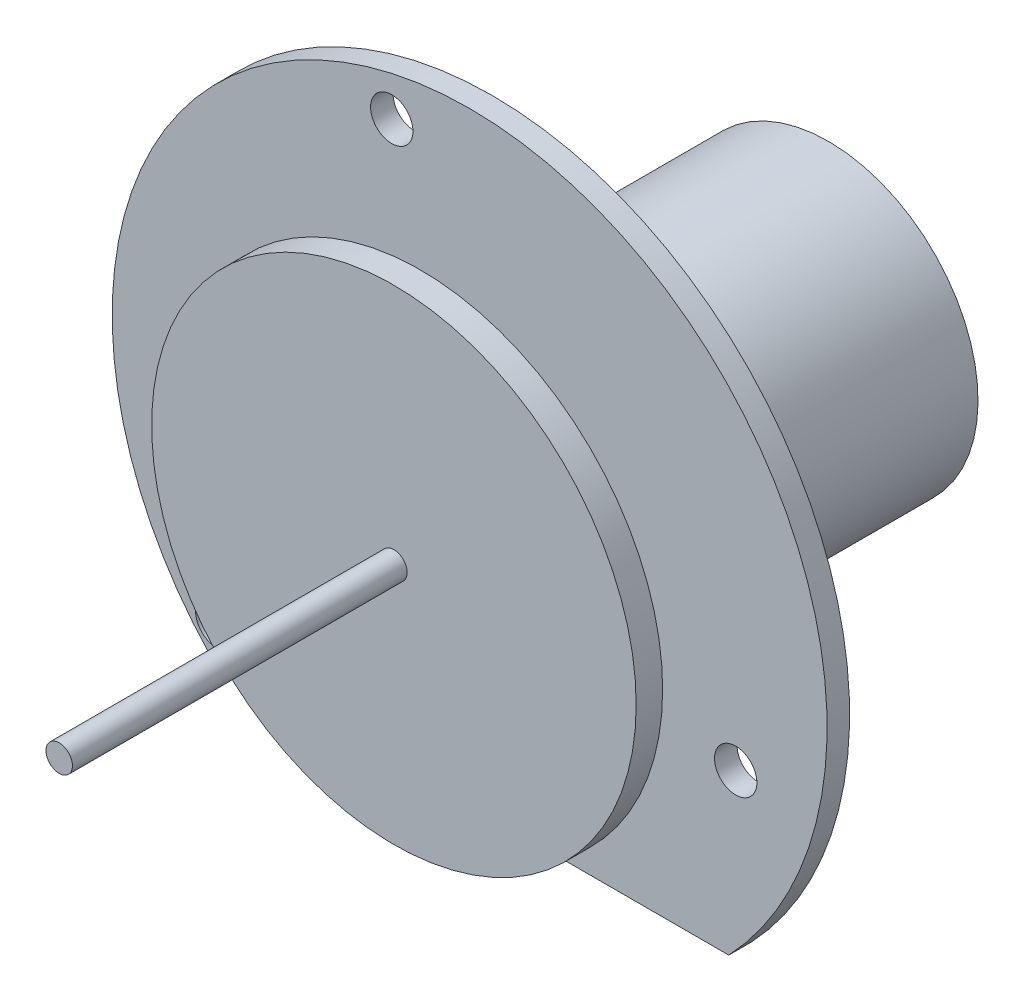
ISO-10303-21;
HEADER;
FILE_DESCRIPTION(('STEP AP214'),'2;1');
FILE_NAME('part.step','',(''),(''),'','','');
FILE_SCHEMA(('AUTOMOTIVE_DESIGN { 1 0 10303 214 1 1 1 1 }'));
ENDSEC;
DATA;
#1=APPLICATION_CONTEXT('core data for automotive mechanical design processes');
#2=APPLICATION_PROTOCOL_DEFINITION('international standard','automotive_design',2000,#1);
#3=PRODUCT_CONTEXT('',#1,'mechanical');
#4=PRODUCT('Part','Part','',(#3));
#5=PRODUCT_RELATED_PRODUCT_CATEGORY('part','',(#4));
#6=PRODUCT_DEFINITION_FORMATION('','',#4);
#7=PRODUCT_DEFINITION_CONTEXT('part definition',#1,'design');
#8=PRODUCT_DEFINITION('design','',#6,#7);
#9=PRODUCT_DEFINITION_SHAPE('','',#8);
#10=(LENGTH_UNIT() NAMED_UNIT(*) SI_UNIT(.MILLI.,.METRE.));
#11=(NAMED_UNIT(*) PLANE_ANGLE_UNIT() SI_UNIT($,.RADIAN.));
#12=(NAMED_UNIT(*) SI_UNIT($,.STERADIAN.) SOLID_ANGLE_UNIT());
#13=UNCERTAINTY_MEASURE_WITH_UNIT(LENGTH_MEASURE(1.E-05),#10,'distance_accuracy_value','');
#14=(GEOMETRIC_REPRESENTATION_CONTEXT(3) GLOBAL_UNCERTAINTY_ASSIGNED_CONTEXT((#13)) GLOBAL_UNIT_ASSIGNED_CONTEXT((#10,
#11,#12)) REPRESENTATION_CONTEXT('',''));
#15=CARTESIAN_POINT('',(0.,0.,0.));
#16=DIRECTION('',(0.,0.,1.));
#17=DIRECTION('',(1.,0.,0.));
#18=AXIS2_PLACEMENT_3D('',#15,#16,#17);
#19=CARTESIAN_POINT('',(0.,0.,-2.032));
#20=DIRECTION('',(0.,0.,-1.));
#21=DIRECTION('',(-1.,0.,0.));
#22=AXIS2_PLACEMENT_3D('',#19,#20,#21);
#23=PLANE('',#22);
#24=DIRECTION('',(-0.999988548258376,-0.00478574467627186,0.));
#25=VECTOR('',#24,1.);
#26=CARTESIAN_POINT('',(-20.2320228869806,4.38139828145004,-2.032));
#27=LINE('',#26,#25);
#28=CARTESIAN_POINT('',(-13.6556862809375,4.41287130977277,-2.032));
#29=VERTEX_POINT('',#28);
#30=CARTESIAN_POINT('',(-20.2320228869806,4.38139828145004,-2.032));
#31=VERTEX_POINT('',#30);
#32=EDGE_CURVE('E182',#29,#31,#27,.T.);
#33=ORIENTED_EDGE('',*,*,#32,.T.);
#34=CARTESIAN_POINT('',(0.,0.,-2.032));
#35=DIRECTION('',(0.,0.,-1.));
#36=DIRECTION('',(-1.,0.,0.));
#37=AXIS2_PLACEMENT_3D('',#34,#35,#36);
#38=CIRCLE('',#37,20.701);
#39=CARTESIAN_POINT('',(20.2320228869806,4.38139828145005,-2.032));
#40=VERTEX_POINT('',#39);
#41=EDGE_CURVE('E248',#31,#40,#38,.T.);
#42=ORIENTED_EDGE('',*,*,#41,.T.);
#43=DIRECTION('',(0.999988548258376,-0.00478574467627186,0.));
#44=VECTOR('',#43,1.);
#45=CARTESIAN_POINT('',(20.2320228869806,4.38139828145004,-2.032));
#46=LINE('',#45,#44);
#47=CARTESIAN_POINT('',(13.6556862809375,4.41287130977277,-2.032));
#48=VERTEX_POINT('',#47);
#49=EDGE_CURVE('E192',#48,#40,#46,.T.);
#50=ORIENTED_EDGE('',*,*,#49,.F.);
#51=CARTESIAN_POINT('',(0.,0.,-2.032));
#52=DIRECTION('',(0.,0.,-1.));
#53=DIRECTION('',(-1.,0.,0.));
#54=AXIS2_PLACEMENT_3D('',#51,#52,#53);
#55=CIRCLE('',#54,14.351);
#56=EDGE_CURVE('E253',#29,#48,#55,.T.);
#57=ORIENTED_EDGE('',*,*,#56,.F.);
#58=EDGE_LOOP('',(#33,#42,#50,#57));
#59=FACE_BOUND('',#58,.T.);
#60=ADVANCED_FACE('F33',(#59),#23,.T.);
#61=DIRECTION('',(1.,0.,0.));
#62=VECTOR('',#61,1.);
#63=CARTESIAN_POINT('',(-13.6347541118696,-4.47712869022722,-2.032));
#64=LINE('',#63,#62);
#65=CARTESIAN_POINT('',(-20.2110543933547,-4.47712869022722,-2.032));
#66=VERTEX_POINT('',#65);
#67=CARTESIAN_POINT('',(-13.6347541118696,-4.47712869022722,-2.032));
#68=VERTEX_POINT('',#67);
#69=EDGE_CURVE('E135',#66,#68,#64,.T.);
#70=ORIENTED_EDGE('',*,*,#69,.T.);
#71=CARTESIAN_POINT('',(13.6347541118696,-4.47712869022722,-2.032));
#72=VERTEX_POINT('',#71);
#73=EDGE_CURVE('E249',#72,#68,#55,.T.);
#74=ORIENTED_EDGE('',*,*,#73,.F.);
#75=DIRECTION('',(-1.,0.,0.));
#76=VECTOR('',#75,1.);
#77=CARTESIAN_POINT('',(13.6347541118696,-4.47712869022722,-2.032));
#78=LINE('',#77,#76);
#79=CARTESIAN_POINT('',(20.2110543933547,-4.47712869022722,-2.032));
#80=VERTEX_POINT('',#79);
#81=EDGE_CURVE('E220',#80,#72,#78,.T.);
#82=ORIENTED_EDGE('',*,*,#81,.F.);
#83=EDGE_CURVE('E260',#80,#66,#38,.T.);
#84=ORIENTED_EDGE('',*,*,#83,.T.);
#85=EDGE_LOOP('',(#70,#74,#82,#84));
#86=FACE_BOUND('',#85,.T.);
#87=ADVANCED_FACE('F289',(#86),#23,.T.);
#88=CARTESIAN_POINT('',(0.,0.,-32.258));
#89=DIRECTION('',(0.,0.,1.));
#90=DIRECTION('',(1.,0.,0.));
#91=AXIS2_PLACEMENT_3D('',#88,#89,#90);
#92=CYLINDRICAL_SURFACE('',#91,14.351);
#93=CARTESIAN_POINT('',(0.,0.,-32.258));
#94=DIRECTION('',(0.,0.,-1.));
#95=DIRECTION('',(-1.,0.,0.));
#96=AXIS2_PLACEMENT_3D('',#93,#94,#95);
#97=CIRCLE('',#96,14.351);
#98=CARTESIAN_POINT('',(-14.351,0.,-32.258));
#99=VERTEX_POINT('',#98);
#100=EDGE_CURVE('E245',#99,#99,#97,.T.);
#101=ORIENTED_EDGE('',*,*,#100,.F.);
#102=EDGE_LOOP('',(#101));
#103=FACE_BOUND('',#102,.T.);
#104=CARTESIAN_POINT('',(0.,0.,-9.652));
#105=DIRECTION('',(0.,0.,1.));
#106=DIRECTION('',(1.,0.,0.));
#107=AXIS2_PLACEMENT_3D('',#104,#105,#106);
#108=CIRCLE('',#107,14.351);
#109=CARTESIAN_POINT('',(-13.6556862809375,4.41287130977277,-9.652));
#110=VERTEX_POINT('',#109);
#111=CARTESIAN_POINT('',(-13.6347541118696,-4.47712869022722,-9.652));
#112=VERTEX_POINT('',#111);
#113=EDGE_CURVE('E11',#110,#112,#108,.T.);
#114=ORIENTED_EDGE('',*,*,#113,.F.);
#115=DIRECTION('',(0.,0.,1.));
#116=VECTOR('',#115,1.);
#117=CARTESIAN_POINT('',(-13.6556862809375,4.41287130977277,-9.652));
#118=LINE('',#117,#116);
#119=EDGE_CURVE('E52',#110,#29,#118,.T.);
#120=ORIENTED_EDGE('',*,*,#119,.T.);
#121=ORIENTED_EDGE('',*,*,#56,.T.);
#122=DIRECTION('',(0.,0.,1.));
#123=VECTOR('',#122,1.);
#124=CARTESIAN_POINT('',(13.6556862809375,4.41287130977277,-9.652));
#125=LINE('',#124,#123);
#126=CARTESIAN_POINT('',(13.6556862809375,4.41287130977277,-9.652));
#127=VERTEX_POINT('',#126);
#128=EDGE_CURVE('E337',#127,#48,#125,.T.);
#129=ORIENTED_EDGE('',*,*,#128,.F.);
#130=CARTESIAN_POINT('',(0.,0.,-9.652));
#131=DIRECTION('',(0.,0.,1.));
#132=DIRECTION('',(1.,0.,0.));
#133=AXIS2_PLACEMENT_3D('',#130,#131,#132);
#134=CIRCLE('',#133,14.351);
#135=CARTESIAN_POINT('',(13.6347541118696,-4.47712869022722,-9.652));
#136=VERTEX_POINT('',#135);
#137=EDGE_CURVE('E42',#136,#127,#134,.T.);
#138=ORIENTED_EDGE('',*,*,#137,.F.);
#139=DIRECTION('',(0.,0.,1.));
#140=VECTOR('',#139,1.);
#141=CARTESIAN_POINT('',(13.6347541118696,-4.47712869022722,-9.652));
#142=LINE('',#141,#140);
#143=EDGE_CURVE('E235',#136,#72,#142,.T.);
#144=ORIENTED_EDGE('',*,*,#143,.T.);
#145=ORIENTED_EDGE('',*,*,#73,.T.);
#146=DIRECTION('',(0.,0.,1.));
#147=VECTOR('',#146,1.);
#148=CARTESIAN_POINT('',(-13.6347541118696,-4.47712869022722,-9.652));
#149=LINE('',#148,#147);
#150=EDGE_CURVE('E146',#112,#68,#149,.T.);
#151=ORIENTED_EDGE('',*,*,#150,.F.);
#152=EDGE_LOOP('',(#114,#120,#121,#129,#138,#144,#145,#151));
#153=FACE_BOUND('',#152,.T.);
#154=ADVANCED_FACE('F351',(#103,#153),#92,.T.);
#155=CARTESIAN_POINT('',(0.,0.,2.159));
#156=DIRECTION('',(0.,0.,-1.));
#157=DIRECTION('',(-1.,0.,0.));
#158=AXIS2_PLACEMENT_3D('',#155,#156,#157);
#159=CYLINDRICAL_SURFACE('',#158,34.29);
#160=CARTESIAN_POINT('',(0.,0.,2.159));
#161=DIRECTION('',(0.,0.,1.));
#162=DIRECTION('',(1.,0.,0.));
#163=AXIS2_PLACEMENT_3D('',#160,#161,#162);
#164=CIRCLE('',#163,34.29);
#165=CARTESIAN_POINT('',(24.8556877997773,-23.622,2.159));
#166=VERTEX_POINT('',#165);
#167=CARTESIAN_POINT('',(-24.8556877997773,-23.622,2.159));
#168=VERTEX_POINT('',#167);
#169=EDGE_CURVE('E387',#166,#168,#164,.T.);
#170=ORIENTED_EDGE('',*,*,#169,.F.);
#171=DIRECTION('',(0.,0.,-1.));
#172=VECTOR('',#171,1.);
#173=CARTESIAN_POINT('',(24.8556877997773,-23.622,2.159));
#174=LINE('',#173,#172);
#175=CARTESIAN_POINT('',(24.8556877997773,-23.622,0.));
#176=VERTEX_POINT('',#175);
#177=EDGE_CURVE('E242',#166,#176,#174,.T.);
#178=ORIENTED_EDGE('',*,*,#177,.T.);
#179=CARTESIAN_POINT('',(0.,0.,0.));
#180=DIRECTION('',(0.,0.,1.));
#181=DIRECTION('',(1.,0.,0.));
#182=AXIS2_PLACEMENT_3D('',#179,#180,#181);
#183=CIRCLE('',#182,34.29);
#184=CARTESIAN_POINT('',(-24.8556877997773,-23.622,0.));
#185=VERTEX_POINT('',#184);
#186=EDGE_CURVE('E389',#176,#185,#183,.T.);
#187=ORIENTED_EDGE('',*,*,#186,.T.);
#188=DIRECTION('',(0.,0.,-1.));
#189=VECTOR('',#188,1.);
#190=CARTESIAN_POINT('',(-24.8556877997773,-23.622,2.159));
#191=LINE('',#190,#189);
#192=EDGE_CURVE('E239',#185,#168,#191,.F.);
#193=ORIENTED_EDGE('',*,*,#192,.T.);
#194=EDGE_LOOP('',(#170,#178,#187,#193));
#195=FACE_BOUND('',#194,.T.);
#196=ADVANCED_FACE('F35',(#195),#159,.T.);
#197=CARTESIAN_POINT('',(0.,0.,2.159));
#198=DIRECTION('',(0.,0.,1.));
#199=DIRECTION('',(1.,0.,0.));
#200=AXIS2_PLACEMENT_3D('',#197,#198,#199);
#201=PLANE('',#200);
#202=CARTESIAN_POINT('',(0.,0.,2.159));
#203=DIRECTION('',(0.,0.,1.));
#204=DIRECTION('',(1.,0.,0.));
#205=AXIS2_PLACEMENT_3D('',#202,#203,#204);
#206=CIRCLE('',#205,3.175);
#207=CARTESIAN_POINT('',(3.175,0.,2.159));
#208=VERTEX_POINT('',#207);
#209=EDGE_CURVE('E459',#208,#208,#206,.T.);
#210=ORIENTED_EDGE('',*,*,#209,.F.);
#211=EDGE_LOOP('',(#210));
#212=FACE_BOUND('',#211,.T.);
#213=CARTESIAN_POINT('',(-24.2610998869317,-20.6264765028923,2.159));
#214=DIRECTION('',(0.,0.,1.));
#215=DIRECTION('',(1.,0.,0.));
#216=AXIS2_PLACEMENT_3D('',#213,#214,#215);
#217=CIRCLE('',#216,2.032);
#218=CARTESIAN_POINT('',(-22.2290998869317,-20.6264765028923,2.159));
#219=VERTEX_POINT('',#218);
#220=EDGE_CURVE('E311',#219,#219,#217,.T.);
#221=ORIENTED_EDGE('',*,*,#220,.F.);
#222=EDGE_LOOP('',(#221));
#223=FACE_BOUND('',#222,.T.);
#224=CARTESIAN_POINT('',(-7.47196911393407,29.6655234971077,2.159));
#225=DIRECTION('',(0.,0.,1.));
#226=DIRECTION('',(1.,0.,0.));
#227=AXIS2_PLACEMENT_3D('',#224,#225,#226);
#228=CIRCLE('',#227,2.032);
#229=CARTESIAN_POINT('',(-5.43996911393407,29.6655234971077,2.159));
#230=VERTEX_POINT('',#229);
#231=EDGE_CURVE('E471',#230,#230,#228,.T.);
#232=ORIENTED_EDGE('',*,*,#231,.F.);
#233=EDGE_LOOP('',(#232));
#234=FACE_BOUND('',#233,.T.);
#235=CARTESIAN_POINT('',(25.5229001130683,-7.95282373789204,2.159));
#236=DIRECTION('',(0.,0.,1.));
#237=DIRECTION('',(1.,0.,0.));
#238=AXIS2_PLACEMENT_3D('',#235,#236,#237);
#239=CIRCLE('',#238,2.032);
#240=CARTESIAN_POINT('',(27.5549001130683,-7.95282373789204,2.159));
#241=VERTEX_POINT('',#240);
#242=EDGE_CURVE('E466',#241,#241,#239,.T.);
#243=ORIENTED_EDGE('',*,*,#242,.F.);
#244=EDGE_LOOP('',(#243));
#245=FACE_BOUND('',#244,.T.);
#246=DIRECTION('',(-1.,0.,0.));
#247=VECTOR('',#246,1.);
#248=CARTESIAN_POINT('',(-36.2560555223226,-23.622,2.159));
#249=LINE('',#248,#247);
#250=EDGE_CURVE('E234',#166,#168,#249,.T.);
#251=ORIENTED_EDGE('',*,*,#250,.F.);
#252=ORIENTED_EDGE('',*,*,#169,.T.);
#253=EDGE_LOOP('',(#251,#252));
#254=FACE_BOUND('',#253,.T.);
#255=ADVANCED_FACE('F370',(#212,#223,#234,#245,#254),#201,.T.);
#256=CARTESIAN_POINT('',(0.,0.,0.));
#257=DIRECTION('',(0.,0.,1.));
#258=DIRECTION('',(1.,0.,0.));
#259=AXIS2_PLACEMENT_3D('',#256,#257,#258);
#260=PLANE('',#259);
#261=CARTESIAN_POINT('',(-24.2610998869317,-20.6264765028923,0.));
#262=DIRECTION('',(0.,0.,1.));
#263=DIRECTION('',(1.,0.,0.));
#264=AXIS2_PLACEMENT_3D('',#261,#262,#263);
#265=CIRCLE('',#264,2.032);
#266=CARTESIAN_POINT('',(-22.2290998869317,-20.6264765028923,0.));
#267=VERTEX_POINT('',#266);
#268=EDGE_CURVE('E313',#267,#267,#265,.T.);
#269=ORIENTED_EDGE('',*,*,#268,.T.);
#270=EDGE_LOOP('',(#269));
#271=FACE_BOUND('',#270,.T.);
#272=CARTESIAN_POINT('',(-7.47196911393407,29.6655234971077,0.));
#273=DIRECTION('',(0.,0.,1.));
#274=DIRECTION('',(1.,0.,0.));
#275=AXIS2_PLACEMENT_3D('',#272,#273,#274);
#276=CIRCLE('',#275,2.032);
#277=CARTESIAN_POINT('',(-5.43996911393407,29.6655234971077,0.));
#278=VERTEX_POINT('',#277);
#279=EDGE_CURVE('E310',#278,#278,#276,.T.);
#280=ORIENTED_EDGE('',*,*,#279,.T.);
#281=EDGE_LOOP('',(#280));
#282=FACE_BOUND('',#281,.T.);
#283=CARTESIAN_POINT('',(25.5229001130683,-7.95282373789204,0.));
#284=DIRECTION('',(0.,0.,1.));
#285=DIRECTION('',(1.,0.,0.));
#286=AXIS2_PLACEMENT_3D('',#283,#284,#285);
#287=CIRCLE('',#286,2.032);
#288=CARTESIAN_POINT('',(27.5549001130683,-7.95282373789204,0.));
#289=VERTEX_POINT('',#288);
#290=EDGE_CURVE('E302',#289,#289,#287,.T.);
#291=ORIENTED_EDGE('',*,*,#290,.T.);
#292=EDGE_LOOP('',(#291));
#293=FACE_BOUND('',#292,.T.);
#294=CARTESIAN_POINT('',(0.,0.,0.));
#295=DIRECTION('',(0.,0.,-1.));
#296=DIRECTION('',(-1.,0.,0.));
#297=AXIS2_PLACEMENT_3D('',#294,#295,#296);
#298=CIRCLE('',#297,20.701);
#299=CARTESIAN_POINT('',(-20.701,0.,0.));
#300=VERTEX_POINT('',#299);
#301=EDGE_CURVE('E256',#300,#300,#298,.T.);
#302=ORIENTED_EDGE('',*,*,#301,.F.);
#303=EDGE_LOOP('',(#302));
#304=FACE_BOUND('',#303,.T.);
#305=ORIENTED_EDGE('',*,*,#186,.F.);
#306=DIRECTION('',(-1.,0.,0.));
#307=VECTOR('',#306,1.);
#308=CARTESIAN_POINT('',(0.,-23.622,0.));
#309=LINE('',#308,#307);
#310=EDGE_CURVE('E252',#176,#185,#309,.T.);
#311=ORIENTED_EDGE('',*,*,#310,.T.);
#312=EDGE_LOOP('',(#305,#311));
#313=FACE_BOUND('',#312,.T.);
#314=ADVANCED_FACE('F288',(#271,#282,#293,#304,#313),#260,.F.);
#315=CARTESIAN_POINT('',(0.,0.,-2.032));
#316=DIRECTION('',(0.,0.,1.));
#317=DIRECTION('',(1.,0.,0.));
#318=AXIS2_PLACEMENT_3D('',#315,#316,#317);
#319=CYLINDRICAL_SURFACE('',#318,20.701);
#320=CARTESIAN_POINT('',(20.2320228869806,4.38139828145004,-2.032));
#321=CARTESIAN_POINT('',(20.701,2.19042161913865,-2.032));
#322=CARTESIAN_POINT('',(20.701,-1.02565525517129E-13,-2.032));
#323=B_SPLINE_CURVE_WITH_KNOTS('',2,(#320,#321,#322),.UNSPECIFIED.,.F.,.F.,(3,3),(0.,
0.494532666623101),.UNSPECIFIED.);
#324=CARTESIAN_POINT('',(20.701,-1.02565525517129E-13,-2.032));
#325=VERTEX_POINT('',#324);
#326=EDGE_CURVE('E228',#40,#325,#323,.T.);
#327=ORIENTED_EDGE('',*,*,#326,.F.);
#328=ORIENTED_EDGE('',*,*,#41,.F.);
#329=CARTESIAN_POINT('',(-20.701,1.31080042653497E-12,-2.032));
#330=CARTESIAN_POINT('',(-20.7009999999999,2.19042161913935,-2.032));
#331=CARTESIAN_POINT('',(-20.2320228869806,4.38139828145004,-2.032));
#332=B_SPLINE_CURVE_WITH_KNOTS('',2,(#329,#330,#331),.UNSPECIFIED.,.F.,.F.,(3,3),(0.,
0.494532666622941),.UNSPECIFIED.);
#333=CARTESIAN_POINT('',(-20.701,1.31080042653498E-12,-2.032));
#334=VERTEX_POINT('',#333);
#335=EDGE_CURVE('E122',#31,#334,#332,.F.);
#336=ORIENTED_EDGE('',*,*,#335,.T.);
#337=CARTESIAN_POINT('',(-20.2110543933547,-4.47712869022722,-2.032));
#338=CARTESIAN_POINT('',(-20.7010000000001,-2.23885427500121,-2.032));
#339=CARTESIAN_POINT('',(-20.701,1.31080042653497E-12,-2.032));
#340=B_SPLINE_CURVE_WITH_KNOTS('',2,(#337,#338,#339),.UNSPECIFIED.,.F.,.F.,(3,3),
(0.494532666622941,1.),.UNSPECIFIED.);
#341=EDGE_CURVE('E315',#334,#66,#340,.F.);
#342=ORIENTED_EDGE('',*,*,#341,.T.);
#343=ORIENTED_EDGE('',*,*,#83,.F.);
#344=CARTESIAN_POINT('',(20.701,-1.02565525517129E-13,-2.032));
#345=CARTESIAN_POINT('',(20.701,-2.23885427500191,-2.032));
#346=CARTESIAN_POINT('',(20.2110543933547,-4.47712869022722,-2.032));
#347=B_SPLINE_CURVE_WITH_KNOTS('',2,(#344,#345,#346),.UNSPECIFIED.,.F.,.F.,(3,3),
(0.494532666623101,1.),.UNSPECIFIED.);
#348=EDGE_CURVE('E127',#325,#80,#347,.T.);
#349=ORIENTED_EDGE('',*,*,#348,.F.);
#350=EDGE_LOOP('',(#327,#328,#336,#342,#343,#349));
#351=FACE_BOUND('',#350,.T.);
#352=ORIENTED_EDGE('',*,*,#301,.T.);
#353=EDGE_LOOP('',(#352));
#354=FACE_BOUND('',#353,.T.);
#355=ADVANCED_FACE('F277',(#351,#354),#319,.T.);
#356=CARTESIAN_POINT('',(0.,0.,-32.258));
#357=DIRECTION('',(0.,0.,-1.));
#358=DIRECTION('',(-1.,0.,0.));
#359=AXIS2_PLACEMENT_3D('',#356,#357,#358);
#360=PLANE('',#359);
#361=ORIENTED_EDGE('',*,*,#100,.T.);
#362=EDGE_LOOP('',(#361));
#363=FACE_BOUND('',#362,.T.);
#364=ADVANCED_FACE('F287',(#363),#360,.T.);
#365=CARTESIAN_POINT('',(-36.2560555223226,-23.622,-32.258));
#366=DIRECTION('',(0.,1.,0.));
#367=DIRECTION('',(0.,0.,1.));
#368=AXIS2_PLACEMENT_3D('',#365,#366,#367);
#369=PLANE('',#368);
#370=ORIENTED_EDGE('',*,*,#250,.T.);
#371=ORIENTED_EDGE('',*,*,#192,.F.);
#372=ORIENTED_EDGE('',*,*,#310,.F.);
#373=ORIENTED_EDGE('',*,*,#177,.F.);
#374=EDGE_LOOP('',(#370,#371,#372,#373));
#375=FACE_BOUND('',#374,.T.);
#376=ADVANCED_FACE('F204',(#375),#369,.F.);
#377=CARTESIAN_POINT('',(20.2320228869806,4.38139828145004,-9.652));
#378=CARTESIAN_POINT('',(21.1803467180873,-0.0489999716570915,-9.652));
#379=CARTESIAN_POINT('',(20.2110543933547,-4.47712869022722,-9.652));
#380=B_SPLINE_CURVE_WITH_KNOTS('',2,(#377,#378,#379),.UNSPECIFIED.,.F.,.F.,(3,3),(0.,1.),.UNSPECIFIED.);
#381=DIRECTION('',(0.,0.,1.));
#382=VECTOR('',#381,1.);
#383=SURFACE_OF_LINEAR_EXTRUSION('',#380,#382);
#384=ORIENTED_EDGE('',*,*,#326,.T.);
#385=ORIENTED_EDGE('',*,*,#348,.T.);
#386=DIRECTION('',(0.,0.,1.));
#387=VECTOR('',#386,1.);
#388=CARTESIAN_POINT('',(20.2110543933547,-4.47712869022722,-9.652));
#389=LINE('',#388,#387);
#390=CARTESIAN_POINT('',(20.2110543933547,-4.47712869022722,-9.652));
#391=VERTEX_POINT('',#390);
#392=EDGE_CURVE('E231',#391,#80,#389,.T.);
#393=ORIENTED_EDGE('',*,*,#392,.F.);
#394=CARTESIAN_POINT('',(20.2320228869806,4.38139828145004,-9.652));
#395=VERTEX_POINT('',#394);
#396=EDGE_CURVE('E185',#395,#391,#380,.T.);
#397=ORIENTED_EDGE('',*,*,#396,.F.);
#398=DIRECTION('',(0.,0.,1.));
#399=VECTOR('',#398,1.);
#400=CARTESIAN_POINT('',(20.2320228869806,4.38139828145004,-9.652));
#401=LINE('',#400,#399);
#402=EDGE_CURVE('E335',#395,#40,#401,.T.);
#403=ORIENTED_EDGE('',*,*,#402,.T.);
#404=EDGE_LOOP('',(#384,#385,#393,#397,#403));
#405=FACE_BOUND('',#404,.T.);
#406=ADVANCED_FACE('F198',(#405),#383,.F.);
#407=CARTESIAN_POINT('',(13.6347541118696,-4.47712869022722,-9.652));
#408=DIRECTION('',(0.,1.,0.));
#409=DIRECTION('',(0.,0.,1.));
#410=AXIS2_PLACEMENT_3D('',#407,#408,#409);
#411=PLANE('',#410);
#412=ORIENTED_EDGE('',*,*,#81,.T.);
#413=ORIENTED_EDGE('',*,*,#143,.F.);
#414=DIRECTION('',(-1.,0.,0.));
#415=VECTOR('',#414,1.);
#416=CARTESIAN_POINT('',(13.6347541118696,-4.47712869022722,-9.652));
#417=LINE('',#416,#415);
#418=EDGE_CURVE('E191',#391,#136,#417,.T.);
#419=ORIENTED_EDGE('',*,*,#418,.F.);
#420=ORIENTED_EDGE('',*,*,#392,.T.);
#421=EDGE_LOOP('',(#412,#413,#419,#420));
#422=FACE_BOUND('',#421,.T.);
#423=ADVANCED_FACE('F203',(#422),#411,.F.);
#424=CARTESIAN_POINT('',(20.2320228869806,4.38139828145004,-9.652));
#425=DIRECTION('',(-0.00478574467627186,-0.999988548258375,0.));
#426=DIRECTION('',(0.999988548258376,-0.00478574467627186,0.));
#427=AXIS2_PLACEMENT_3D('',#424,#425,#426);
#428=PLANE('',#427);
#429=ORIENTED_EDGE('',*,*,#49,.T.);
#430=ORIENTED_EDGE('',*,*,#402,.F.);
#431=DIRECTION('',(0.999988548258376,-0.00478574467627186,0.));
#432=VECTOR('',#431,1.);
#433=CARTESIAN_POINT('',(20.2320228869806,4.38139828145004,-9.652));
#434=LINE('',#433,#432);
#435=EDGE_CURVE('E339',#127,#395,#434,.T.);
#436=ORIENTED_EDGE('',*,*,#435,.F.);
#437=ORIENTED_EDGE('',*,*,#128,.T.);
#438=EDGE_LOOP('',(#429,#430,#436,#437));
#439=FACE_BOUND('',#438,.T.);
#440=ADVANCED_FACE('F333',(#439),#428,.F.);
#441=CARTESIAN_POINT('',(20.7009426791275,-0.0484325880228411,-9.652));
#442=DIRECTION('',(0.,0.,1.));
#443=DIRECTION('',(1.,0.,0.));
#444=AXIS2_PLACEMENT_3D('',#441,#442,#443);
#445=PLANE('',#444);
#446=ORIENTED_EDGE('',*,*,#418,.T.);
#447=ORIENTED_EDGE('',*,*,#137,.T.);
#448=ORIENTED_EDGE('',*,*,#435,.T.);
#449=ORIENTED_EDGE('',*,*,#396,.T.);
#450=EDGE_LOOP('',(#446,#447,#448,#449));
#451=FACE_BOUND('',#450,.T.);
#452=ADVANCED_FACE('F163',(#451),#445,.F.);
#453=CARTESIAN_POINT('',(-20.2320228869806,4.38139828145004,-9.652));
#454=CARTESIAN_POINT('',(-21.1803467180873,-0.0489999716570915,-9.652));
#455=CARTESIAN_POINT('',(-20.2110543933547,-4.47712869022722,-9.652));
#456=B_SPLINE_CURVE_WITH_KNOTS('',2,(#453,#454,#455),.UNSPECIFIED.,.F.,.F.,(3,3),(0.,1.),.UNSPECIFIED.);
#457=DIRECTION('',(0.,0.,1.));
#458=VECTOR('',#457,1.);
#459=SURFACE_OF_LINEAR_EXTRUSION('',#456,#458);
#460=ORIENTED_EDGE('',*,*,#335,.F.);
#461=DIRECTION('',(0.,0.,1.));
#462=VECTOR('',#461,1.);
#463=CARTESIAN_POINT('',(-20.2320228869806,4.38139828145004,-9.652));
#464=LINE('',#463,#462);
#465=CARTESIAN_POINT('',(-20.2320228869806,4.38139828145004,-9.652));
#466=VERTEX_POINT('',#465);
#467=EDGE_CURVE('E115',#466,#31,#464,.T.);
#468=ORIENTED_EDGE('',*,*,#467,.F.);
#469=CARTESIAN_POINT('',(-20.2110543933547,-4.47712869022722,-9.652));
#470=VERTEX_POINT('',#469);
#471=EDGE_CURVE('E119',#466,#470,#456,.T.);
#472=ORIENTED_EDGE('',*,*,#471,.T.);
#473=DIRECTION('',(0.,0.,1.));
#474=VECTOR('',#473,1.);
#475=CARTESIAN_POINT('',(-20.2110543933547,-4.47712869022722,-9.652));
#476=LINE('',#475,#474);
#477=EDGE_CURVE('E139',#470,#66,#476,.T.);
#478=ORIENTED_EDGE('',*,*,#477,.T.);
#479=ORIENTED_EDGE('',*,*,#341,.F.);
#480=EDGE_LOOP('',(#460,#468,#472,#478,#479));
#481=FACE_BOUND('',#480,.T.);
#482=ADVANCED_FACE('F117',(#481),#459,.T.);
#483=CARTESIAN_POINT('',(-20.2320228869806,4.38139828145004,-9.652));
#484=DIRECTION('',(-0.00478574467627186,0.999988548258375,0.));
#485=DIRECTION('',(-0.999988548258376,-0.00478574467627186,0.));
#486=AXIS2_PLACEMENT_3D('',#483,#484,#485);
#487=PLANE('',#486);
#488=ORIENTED_EDGE('',*,*,#32,.F.);
#489=ORIENTED_EDGE('',*,*,#119,.F.);
#490=DIRECTION('',(-0.999988548258376,-0.00478574467627186,0.));
#491=VECTOR('',#490,1.);
#492=CARTESIAN_POINT('',(-20.2320228869806,4.38139828145004,-9.652));
#493=LINE('',#492,#491);
#494=EDGE_CURVE('E132',#110,#466,#493,.T.);
#495=ORIENTED_EDGE('',*,*,#494,.T.);
#496=ORIENTED_EDGE('',*,*,#467,.T.);
#497=EDGE_LOOP('',(#488,#489,#495,#496));
#498=FACE_BOUND('',#497,.T.);
#499=ADVANCED_FACE('F137',(#498),#487,.T.);
#500=CARTESIAN_POINT('',(-13.6347541118696,-4.47712869022722,-9.652));
#501=DIRECTION('',(0.,-1.,0.));
#502=DIRECTION('',(0.,0.,-1.));
#503=AXIS2_PLACEMENT_3D('',#500,#501,#502);
#504=PLANE('',#503);
#505=ORIENTED_EDGE('',*,*,#69,.F.);
#506=ORIENTED_EDGE('',*,*,#477,.F.);
#507=DIRECTION('',(1.,0.,0.));
#508=VECTOR('',#507,1.);
#509=CARTESIAN_POINT('',(-13.6347541118696,-4.47712869022722,-9.652));
#510=LINE('',#509,#508);
#511=EDGE_CURVE('E134',#470,#112,#510,.T.);
#512=ORIENTED_EDGE('',*,*,#511,.T.);
#513=ORIENTED_EDGE('',*,*,#150,.T.);
#514=EDGE_LOOP('',(#505,#506,#512,#513));
#515=FACE_BOUND('',#514,.T.);
#516=ADVANCED_FACE('F417',(#515),#504,.T.);
#517=CARTESIAN_POINT('',(-20.7009426791275,-0.0484325880228411,-9.652));
#518=DIRECTION('',(0.,0.,1.));
#519=DIRECTION('',(-1.,0.,0.));
#520=AXIS2_PLACEMENT_3D('',#517,#518,#519);
#521=PLANE('',#520);
#522=ORIENTED_EDGE('',*,*,#494,.F.);
#523=ORIENTED_EDGE('',*,*,#113,.T.);
#524=ORIENTED_EDGE('',*,*,#511,.F.);
#525=ORIENTED_EDGE('',*,*,#471,.F.);
#526=EDGE_LOOP('',(#522,#523,#524,#525));
#527=FACE_BOUND('',#526,.T.);
#528=ADVANCED_FACE('F131',(#527),#521,.F.);
#529=CARTESIAN_POINT('',(25.5229001130683,-7.95282373789204,-32.258));
#530=DIRECTION('',(0.,0.,1.));
#531=DIRECTION('',(1.,0.,0.));
#532=AXIS2_PLACEMENT_3D('',#529,#530,#531);
#533=CYLINDRICAL_SURFACE('',#532,2.032);
#534=ORIENTED_EDGE('',*,*,#242,.T.);
#535=EDGE_LOOP('',(#534));
#536=FACE_BOUND('',#535,.T.);
#537=ORIENTED_EDGE('',*,*,#290,.F.);
#538=EDGE_LOOP('',(#537));
#539=FACE_BOUND('',#538,.T.);
#540=ADVANCED_FACE('F423',(#536,#539),#533,.F.);
#541=CARTESIAN_POINT('',(-7.47196911393407,29.6655234971077,-32.258));
#542=DIRECTION('',(0.,0.,1.));
#543=DIRECTION('',(1.,0.,0.));
#544=AXIS2_PLACEMENT_3D('',#541,#542,#543);
#545=CYLINDRICAL_SURFACE('',#544,2.032);
#546=ORIENTED_EDGE('',*,*,#231,.T.);
#547=EDGE_LOOP('',(#546));
#548=FACE_BOUND('',#547,.T.);
#549=ORIENTED_EDGE('',*,*,#279,.F.);
#550=EDGE_LOOP('',(#549));
#551=FACE_BOUND('',#550,.T.);
#552=ADVANCED_FACE('F428',(#548,#551),#545,.F.);
#553=CARTESIAN_POINT('',(-24.2610998869317,-20.6264765028923,-32.258));
#554=DIRECTION('',(0.,0.,1.));
#555=DIRECTION('',(1.,0.,0.));
#556=AXIS2_PLACEMENT_3D('',#553,#554,#555);
#557=CYLINDRICAL_SURFACE('',#556,2.032);
#558=ORIENTED_EDGE('',*,*,#220,.T.);
#559=EDGE_LOOP('',(#558));
#560=FACE_BOUND('',#559,.T.);
#561=ORIENTED_EDGE('',*,*,#268,.F.);
#562=EDGE_LOOP('',(#561));
#563=FACE_BOUND('',#562,.T.);
#564=ADVANCED_FACE('F432',(#560,#563),#557,.F.);
#565=CARTESIAN_POINT('',(0.,0.,6.8834));
#566=DIRECTION('',(0.,0.,-1.));
#567=DIRECTION('',(-1.,0.,0.));
#568=AXIS2_PLACEMENT_3D('',#565,#566,#567);
#569=CYLINDRICAL_SURFACE('',#568,3.175);
#570=CARTESIAN_POINT('',(0.,0.,6.8834));
#571=DIRECTION('',(0.,0.,1.));
#572=DIRECTION('',(1.,0.,0.));
#573=AXIS2_PLACEMENT_3D('',#570,#571,#572);
#574=CIRCLE('',#573,3.175);
#575=CARTESIAN_POINT('',(3.175,0.,6.8834));
#576=VERTEX_POINT('',#575);
#577=EDGE_CURVE('E463',#576,#576,#574,.T.);
#578=ORIENTED_EDGE('',*,*,#577,.F.);
#579=EDGE_LOOP('',(#578));
#580=FACE_BOUND('',#579,.T.);
#581=ORIENTED_EDGE('',*,*,#209,.T.);
#582=EDGE_LOOP('',(#581));
#583=FACE_BOUND('',#582,.T.);
#584=ADVANCED_FACE('F436',(#580,#583),#569,.T.);
#585=CARTESIAN_POINT('',(0.,0.,9.4234));
#586=DIRECTION('',(0.,0.,-1.));
#587=DIRECTION('',(-1.,0.,0.));
#588=AXIS2_PLACEMENT_3D('',#585,#586,#587);
#589=CYLINDRICAL_SURFACE('',#588,23.241);
#590=CARTESIAN_POINT('',(0.,0.,9.4234));
#591=DIRECTION('',(0.,0.,1.));
#592=DIRECTION('',(1.,0.,0.));
#593=AXIS2_PLACEMENT_3D('',#590,#591,#592);
#594=CIRCLE('',#593,23.241);
#595=CARTESIAN_POINT('',(23.241,0.,9.4234));
#596=VERTEX_POINT('',#595);
#597=EDGE_CURVE('E456',#596,#596,#594,.T.);
#598=ORIENTED_EDGE('',*,*,#597,.F.);
#599=EDGE_LOOP('',(#598));
#600=FACE_BOUND('',#599,.T.);
#601=CARTESIAN_POINT('',(0.,0.,6.8834));
#602=DIRECTION('',(0.,0.,1.));
#603=DIRECTION('',(1.,0.,0.));
#604=AXIS2_PLACEMENT_3D('',#601,#602,#603);
#605=CIRCLE('',#604,23.241);
#606=CARTESIAN_POINT('',(23.241,0.,6.8834));
#607=VERTEX_POINT('',#606);
#608=EDGE_CURVE('E457',#607,#607,#605,.T.);
#609=ORIENTED_EDGE('',*,*,#608,.T.);
#610=EDGE_LOOP('',(#609));
#611=FACE_BOUND('',#610,.T.);
#612=ADVANCED_FACE('F440',(#600,#611),#589,.T.);
#613=CARTESIAN_POINT('',(0.,0.,9.4234));
#614=DIRECTION('',(0.,0.,1.));
#615=DIRECTION('',(1.,0.,0.));
#616=AXIS2_PLACEMENT_3D('',#613,#614,#615);
#617=PLANE('',#616);
#618=CARTESIAN_POINT('',(0.,0.,9.4234));
#619=DIRECTION('',(0.,0.,1.));
#620=DIRECTION('',(1.,0.,0.));
#621=AXIS2_PLACEMENT_3D('',#618,#619,#620);
#622=CIRCLE('',#621,1.27);
#623=CARTESIAN_POINT('',(1.27,0.,9.4234));
#624=VERTEX_POINT('',#623);
#625=EDGE_CURVE('E37',#624,#624,#622,.T.);
#626=ORIENTED_EDGE('',*,*,#625,.F.);
#627=EDGE_LOOP('',(#626));
#628=FACE_BOUND('',#627,.T.);
#629=ORIENTED_EDGE('',*,*,#597,.T.);
#630=EDGE_LOOP('',(#629));
#631=FACE_BOUND('',#630,.T.);
#632=ADVANCED_FACE('F444',(#628,#631),#617,.T.);
#633=CARTESIAN_POINT('',(0.,0.,6.8834));
#634=DIRECTION('',(0.,0.,1.));
#635=DIRECTION('',(1.,0.,0.));
#636=AXIS2_PLACEMENT_3D('',#633,#634,#635);
#637=PLANE('',#636);
#638=ORIENTED_EDGE('',*,*,#577,.T.);
#639=EDGE_LOOP('',(#638));
#640=FACE_BOUND('',#639,.T.);
#641=ORIENTED_EDGE('',*,*,#608,.F.);
#642=EDGE_LOOP('',(#641));
#643=FACE_BOUND('',#642,.T.);
#644=ADVANCED_FACE('F409',(#640,#643),#637,.F.);
#645=CARTESIAN_POINT('',(0.,0.,41.529));
#646=DIRECTION('',(0.,0.,1.));
#647=DIRECTION('',(1.,0.,0.));
#648=AXIS2_PLACEMENT_3D('',#645,#646,#647);
#649=PLANE('',#648);
#650=CARTESIAN_POINT('',(0.,0.,41.529));
#651=DIRECTION('',(0.,0.,1.));
#652=DIRECTION('',(1.,0.,0.));
#653=AXIS2_PLACEMENT_3D('',#650,#651,#652);
#654=CIRCLE('',#653,1.27);
#655=CARTESIAN_POINT('',(1.27,0.,41.529));
#656=VERTEX_POINT('',#655);
#657=EDGE_CURVE('E392',#656,#656,#654,.T.);
#658=ORIENTED_EDGE('',*,*,#657,.T.);
#659=EDGE_LOOP('',(#658));
#660=FACE_BOUND('',#659,.T.);
#661=ADVANCED_FACE('F291',(#660),#649,.T.);
#662=CARTESIAN_POINT('',(0.,0.,41.529));
#663=DIRECTION('',(0.,0.,-1.));
#664=DIRECTION('',(-1.,0.,0.));
#665=AXIS2_PLACEMENT_3D('',#662,#663,#664);
#666=CYLINDRICAL_SURFACE('',#665,1.27);
#667=ORIENTED_EDGE('',*,*,#625,.T.);
#668=EDGE_LOOP('',(#667));
#669=FACE_BOUND('',#668,.T.);
#670=ORIENTED_EDGE('',*,*,#657,.F.);
#671=EDGE_LOOP('',(#670));
#672=FACE_BOUND('',#671,.T.);
#673=ADVANCED_FACE('F403',(#669,#672),#666,.T.);
#674=CLOSED_SHELL('',(#60,#87,#154,#196,#255,#314,#355,#364,#376,#406,#423,#440,#452,#482,#499,
#516,#528,#540,#552,#564,#584,#612,#632,#644,#661,#673));
#675=MANIFOLD_SOLID_BREP('B2',#674);
#676=ADVANCED_BREP_SHAPE_REPRESENTATION('',(#18,#675),#14);
#677=SHAPE_DEFINITION_REPRESENTATION(#9,#676);
ENDSEC;
END-ISO-10303-21;
